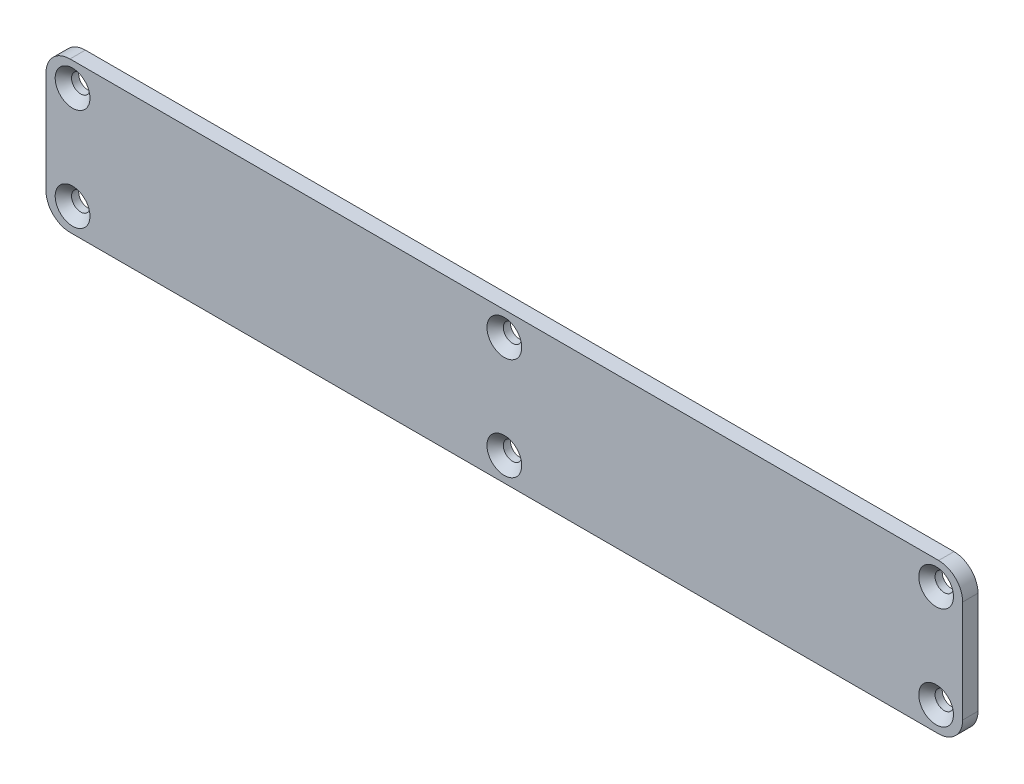
ISO-10303-21;
HEADER;
FILE_DESCRIPTION(('STEP AP214'),'2;1');
FILE_NAME('part.step','',(''),(''),'','','');
FILE_SCHEMA(('AUTOMOTIVE_DESIGN { 1 0 10303 214 1 1 1 1 }'));
ENDSEC;
DATA;
#1=APPLICATION_CONTEXT('core data for automotive mechanical design processes');
#2=APPLICATION_PROTOCOL_DEFINITION('international standard','automotive_design',2000,#1);
#3=PRODUCT_CONTEXT('',#1,'mechanical');
#4=PRODUCT('Part','Part','',(#3));
#5=PRODUCT_RELATED_PRODUCT_CATEGORY('part','',(#4));
#6=PRODUCT_DEFINITION_FORMATION('','',#4);
#7=PRODUCT_DEFINITION_CONTEXT('part definition',#1,'design');
#8=PRODUCT_DEFINITION('design','',#6,#7);
#9=PRODUCT_DEFINITION_SHAPE('','',#8);
#10=(LENGTH_UNIT() NAMED_UNIT(*) SI_UNIT(.MILLI.,.METRE.));
#11=(NAMED_UNIT(*) PLANE_ANGLE_UNIT() SI_UNIT($,.RADIAN.));
#12=(NAMED_UNIT(*) SI_UNIT($,.STERADIAN.) SOLID_ANGLE_UNIT());
#13=UNCERTAINTY_MEASURE_WITH_UNIT(LENGTH_MEASURE(1.E-05),#10,'distance_accuracy_value','');
#14=(GEOMETRIC_REPRESENTATION_CONTEXT(3) GLOBAL_UNCERTAINTY_ASSIGNED_CONTEXT((#13)) GLOBAL_UNIT_ASSIGNED_CONTEXT((#10,
#11,#12)) REPRESENTATION_CONTEXT('',''));
#15=CARTESIAN_POINT('',(0.,0.,0.));
#16=DIRECTION('',(0.,0.,1.));
#17=DIRECTION('',(1.,0.,0.));
#18=AXIS2_PLACEMENT_3D('',#15,#16,#17);
#19=CARTESIAN_POINT('',(0.,0.,3.));
#20=DIRECTION('',(0.,0.,-1.));
#21=DIRECTION('',(-1.,0.,0.));
#22=AXIS2_PLACEMENT_3D('',#19,#20,#21);
#23=PLANE('',#22);
#24=CARTESIAN_POINT('',(0.,-10.,3.));
#25=DIRECTION('',(0.,0.,1.));
#26=DIRECTION('',(1.,0.,0.));
#27=AXIS2_PLACEMENT_3D('',#24,#25,#26);
#28=CIRCLE('',#27,3.4);
#29=CARTESIAN_POINT('',(3.40000000000001,-10.,3.));
#30=VERTEX_POINT('',#29);
#31=EDGE_CURVE('E206',#30,#30,#28,.T.);
#32=ORIENTED_EDGE('',*,*,#31,.F.);
#33=EDGE_LOOP('',(#32));
#34=FACE_BOUND('',#33,.T.);
#35=CARTESIAN_POINT('',(0.,10.,3.));
#36=DIRECTION('',(0.,0.,1.));
#37=DIRECTION('',(1.,0.,0.));
#38=AXIS2_PLACEMENT_3D('',#35,#36,#37);
#39=CIRCLE('',#38,3.4);
#40=CARTESIAN_POINT('',(3.40000000000001,10.,3.));
#41=VERTEX_POINT('',#40);
#42=EDGE_CURVE('E199',#41,#41,#39,.T.);
#43=ORIENTED_EDGE('',*,*,#42,.F.);
#44=EDGE_LOOP('',(#43));
#45=FACE_BOUND('',#44,.T.);
#46=CARTESIAN_POINT('',(-84.5,-10.,3.));
#47=DIRECTION('',(0.,0.,1.));
#48=DIRECTION('',(1.,0.,0.));
#49=AXIS2_PLACEMENT_3D('',#46,#47,#48);
#50=CIRCLE('',#49,3.4);
#51=CARTESIAN_POINT('',(-81.1,-10.,3.));
#52=VERTEX_POINT('',#51);
#53=EDGE_CURVE('E192',#52,#52,#50,.T.);
#54=ORIENTED_EDGE('',*,*,#53,.F.);
#55=EDGE_LOOP('',(#54));
#56=FACE_BOUND('',#55,.T.);
#57=CARTESIAN_POINT('',(84.5,10.,3.));
#58=DIRECTION('',(0.,0.,1.));
#59=DIRECTION('',(1.,0.,0.));
#60=AXIS2_PLACEMENT_3D('',#57,#58,#59);
#61=CIRCLE('',#60,3.4);
#62=CARTESIAN_POINT('',(87.9,10.,3.));
#63=VERTEX_POINT('',#62);
#64=EDGE_CURVE('E185',#63,#63,#61,.T.);
#65=ORIENTED_EDGE('',*,*,#64,.F.);
#66=EDGE_LOOP('',(#65));
#67=FACE_BOUND('',#66,.T.);
#68=CARTESIAN_POINT('',(84.5,-10.,3.));
#69=DIRECTION('',(0.,0.,1.));
#70=DIRECTION('',(1.,0.,0.));
#71=AXIS2_PLACEMENT_3D('',#68,#69,#70);
#72=CIRCLE('',#71,3.4);
#73=CARTESIAN_POINT('',(87.9,-10.,3.));
#74=VERTEX_POINT('',#73);
#75=EDGE_CURVE('E178',#74,#74,#72,.T.);
#76=ORIENTED_EDGE('',*,*,#75,.F.);
#77=EDGE_LOOP('',(#76));
#78=FACE_BOUND('',#77,.T.);
#79=CARTESIAN_POINT('',(-84.5,10.,3.));
#80=DIRECTION('',(0.,0.,1.));
#81=DIRECTION('',(1.,0.,0.));
#82=AXIS2_PLACEMENT_3D('',#79,#80,#81);
#83=CIRCLE('',#82,3.4);
#84=CARTESIAN_POINT('',(-81.1,10.,3.));
#85=VERTEX_POINT('',#84);
#86=EDGE_CURVE('E163',#85,#85,#83,.T.);
#87=ORIENTED_EDGE('',*,*,#86,.F.);
#88=EDGE_LOOP('',(#87));
#89=FACE_BOUND('',#88,.T.);
#90=CARTESIAN_POINT('',(-85.,-9.99999999999999,3.));
#91=DIRECTION('',(0.,0.,1.));
#92=DIRECTION('',(1.,0.,0.));
#93=AXIS2_PLACEMENT_3D('',#90,#91,#92);
#94=CIRCLE('',#93,4.7);
#95=CARTESIAN_POINT('',(-89.7,-10.,3.));
#96=VERTEX_POINT('',#95);
#97=CARTESIAN_POINT('',(-85.,-14.7,3.));
#98=VERTEX_POINT('',#97);
#99=EDGE_CURVE('E141',#96,#98,#94,.T.);
#100=ORIENTED_EDGE('',*,*,#99,.T.);
#101=DIRECTION('',(1.,0.,0.));
#102=VECTOR('',#101,1.);
#103=CARTESIAN_POINT('',(-85.,-14.7,3.));
#104=LINE('',#103,#102);
#105=CARTESIAN_POINT('',(84.9999999999999,-14.7,3.));
#106=VERTEX_POINT('',#105);
#107=EDGE_CURVE('E144',#98,#106,#104,.T.);
#108=ORIENTED_EDGE('',*,*,#107,.T.);
#109=CARTESIAN_POINT('',(85.,-9.99999999999999,3.));
#110=DIRECTION('',(0.,0.,1.));
#111=DIRECTION('',(1.,0.,0.));
#112=AXIS2_PLACEMENT_3D('',#109,#110,#111);
#113=CIRCLE('',#112,4.69999999999999);
#114=CARTESIAN_POINT('',(89.7,-9.99999999999999,3.));
#115=VERTEX_POINT('',#114);
#116=EDGE_CURVE('E55',#106,#115,#113,.T.);
#117=ORIENTED_EDGE('',*,*,#116,.T.);
#118=DIRECTION('',(0.,1.,0.));
#119=VECTOR('',#118,1.);
#120=CARTESIAN_POINT('',(89.7,-10.,3.));
#121=LINE('',#120,#119);
#122=CARTESIAN_POINT('',(89.7,10.,3.));
#123=VERTEX_POINT('',#122);
#124=EDGE_CURVE('E112',#115,#123,#121,.T.);
#125=ORIENTED_EDGE('',*,*,#124,.T.);
#126=CARTESIAN_POINT('',(85.,10.,3.));
#127=DIRECTION('',(0.,0.,1.));
#128=DIRECTION('',(1.,0.,0.));
#129=AXIS2_PLACEMENT_3D('',#126,#127,#128);
#130=CIRCLE('',#129,4.70000000000001);
#131=CARTESIAN_POINT('',(84.9999999999999,14.7,3.));
#132=VERTEX_POINT('',#131);
#133=EDGE_CURVE('E149',#123,#132,#130,.T.);
#134=ORIENTED_EDGE('',*,*,#133,.T.);
#135=DIRECTION('',(-1.,0.,0.));
#136=VECTOR('',#135,1.);
#137=CARTESIAN_POINT('',(84.9999999999999,14.7,3.));
#138=LINE('',#137,#136);
#139=CARTESIAN_POINT('',(-85.,14.7,3.));
#140=VERTEX_POINT('',#139);
#141=EDGE_CURVE('E152',#132,#140,#138,.T.);
#142=ORIENTED_EDGE('',*,*,#141,.T.);
#143=CARTESIAN_POINT('',(-85.,10.,3.));
#144=DIRECTION('',(0.,0.,1.));
#145=DIRECTION('',(1.,0.,0.));
#146=AXIS2_PLACEMENT_3D('',#143,#144,#145);
#147=CIRCLE('',#146,4.69999999999998);
#148=CARTESIAN_POINT('',(-89.7,10.,3.));
#149=VERTEX_POINT('',#148);
#150=EDGE_CURVE('E155',#140,#149,#147,.T.);
#151=ORIENTED_EDGE('',*,*,#150,.T.);
#152=DIRECTION('',(0.,-1.,0.));
#153=VECTOR('',#152,1.);
#154=CARTESIAN_POINT('',(-89.7,10.,3.));
#155=LINE('',#154,#153);
#156=EDGE_CURVE('E158',#149,#96,#155,.T.);
#157=ORIENTED_EDGE('',*,*,#156,.T.);
#158=EDGE_LOOP('',(#100,#108,#117,#125,#134,#142,#151,#157));
#159=FACE_BOUND('',#158,.T.);
#160=ADVANCED_FACE('F38',(#34,#45,#56,#67,#78,#89,#159),#23,.F.);
#161=CARTESIAN_POINT('',(0.,0.,0.));
#162=DIRECTION('',(0.,0.,-1.));
#163=DIRECTION('',(-1.,0.,0.));
#164=AXIS2_PLACEMENT_3D('',#161,#162,#163);
#165=PLANE('',#164);
#166=CARTESIAN_POINT('',(0.,-10.,0.));
#167=DIRECTION('',(0.,0.,-1.));
#168=DIRECTION('',(-1.,0.,0.));
#169=AXIS2_PLACEMENT_3D('',#166,#167,#168);
#170=CIRCLE('',#169,1.8);
#171=CARTESIAN_POINT('',(-1.79999999999998,-10.,0.));
#172=VERTEX_POINT('',#171);
#173=EDGE_CURVE('E11',#172,#172,#170,.T.);
#174=ORIENTED_EDGE('',*,*,#173,.F.);
#175=EDGE_LOOP('',(#174));
#176=FACE_BOUND('',#175,.T.);
#177=CARTESIAN_POINT('',(0.,10.,0.));
#178=DIRECTION('',(0.,0.,-1.));
#179=DIRECTION('',(-1.,0.,0.));
#180=AXIS2_PLACEMENT_3D('',#177,#178,#179);
#181=CIRCLE('',#180,1.8);
#182=CARTESIAN_POINT('',(-1.79999999999998,10.,0.));
#183=VERTEX_POINT('',#182);
#184=EDGE_CURVE('E205',#183,#183,#181,.T.);
#185=ORIENTED_EDGE('',*,*,#184,.F.);
#186=EDGE_LOOP('',(#185));
#187=FACE_BOUND('',#186,.T.);
#188=CARTESIAN_POINT('',(-84.5,-10.,0.));
#189=DIRECTION('',(0.,0.,-1.));
#190=DIRECTION('',(-1.,0.,0.));
#191=AXIS2_PLACEMENT_3D('',#188,#189,#190);
#192=CIRCLE('',#191,1.8);
#193=CARTESIAN_POINT('',(-86.3,-10.,0.));
#194=VERTEX_POINT('',#193);
#195=EDGE_CURVE('E198',#194,#194,#192,.T.);
#196=ORIENTED_EDGE('',*,*,#195,.F.);
#197=EDGE_LOOP('',(#196));
#198=FACE_BOUND('',#197,.T.);
#199=CARTESIAN_POINT('',(84.5,10.,0.));
#200=DIRECTION('',(0.,0.,-1.));
#201=DIRECTION('',(-1.,0.,0.));
#202=AXIS2_PLACEMENT_3D('',#199,#200,#201);
#203=CIRCLE('',#202,1.8);
#204=CARTESIAN_POINT('',(82.7,10.,0.));
#205=VERTEX_POINT('',#204);
#206=EDGE_CURVE('E191',#205,#205,#203,.T.);
#207=ORIENTED_EDGE('',*,*,#206,.F.);
#208=EDGE_LOOP('',(#207));
#209=FACE_BOUND('',#208,.T.);
#210=CARTESIAN_POINT('',(84.5,-10.,0.));
#211=DIRECTION('',(0.,0.,-1.));
#212=DIRECTION('',(-1.,0.,0.));
#213=AXIS2_PLACEMENT_3D('',#210,#211,#212);
#214=CIRCLE('',#213,1.8);
#215=CARTESIAN_POINT('',(82.7,-10.,0.));
#216=VERTEX_POINT('',#215);
#217=EDGE_CURVE('E184',#216,#216,#214,.T.);
#218=ORIENTED_EDGE('',*,*,#217,.F.);
#219=EDGE_LOOP('',(#218));
#220=FACE_BOUND('',#219,.T.);
#221=CARTESIAN_POINT('',(-84.5,10.,0.));
#222=DIRECTION('',(0.,0.,-1.));
#223=DIRECTION('',(-1.,0.,0.));
#224=AXIS2_PLACEMENT_3D('',#221,#222,#223);
#225=CIRCLE('',#224,1.8);
#226=CARTESIAN_POINT('',(-86.3,10.,0.));
#227=VERTEX_POINT('',#226);
#228=EDGE_CURVE('E42',#227,#227,#225,.T.);
#229=ORIENTED_EDGE('',*,*,#228,.F.);
#230=EDGE_LOOP('',(#229));
#231=FACE_BOUND('',#230,.T.);
#232=DIRECTION('',(1.,0.,0.));
#233=VECTOR('',#232,1.);
#234=CARTESIAN_POINT('',(-85.,-14.7,0.));
#235=LINE('',#234,#233);
#236=CARTESIAN_POINT('',(-85.,-14.7,0.));
#237=VERTEX_POINT('',#236);
#238=CARTESIAN_POINT('',(84.9999999999999,-14.7,0.));
#239=VERTEX_POINT('',#238);
#240=EDGE_CURVE('E122',#237,#239,#235,.T.);
#241=ORIENTED_EDGE('',*,*,#240,.F.);
#242=CARTESIAN_POINT('',(-85.,-9.99999999999999,0.));
#243=DIRECTION('',(0.,0.,1.));
#244=DIRECTION('',(1.,0.,0.));
#245=AXIS2_PLACEMENT_3D('',#242,#243,#244);
#246=CIRCLE('',#245,4.7);
#247=CARTESIAN_POINT('',(-89.7,-10.,0.));
#248=VERTEX_POINT('',#247);
#249=EDGE_CURVE('E63',#248,#237,#246,.T.);
#250=ORIENTED_EDGE('',*,*,#249,.F.);
#251=DIRECTION('',(0.,-1.,0.));
#252=VECTOR('',#251,1.);
#253=CARTESIAN_POINT('',(-89.7,10.,0.));
#254=LINE('',#253,#252);
#255=CARTESIAN_POINT('',(-89.7,10.,0.));
#256=VERTEX_POINT('',#255);
#257=EDGE_CURVE('E137',#256,#248,#254,.T.);
#258=ORIENTED_EDGE('',*,*,#257,.F.);
#259=CARTESIAN_POINT('',(-85.,10.,0.));
#260=DIRECTION('',(0.,0.,1.));
#261=DIRECTION('',(1.,0.,0.));
#262=AXIS2_PLACEMENT_3D('',#259,#260,#261);
#263=CIRCLE('',#262,4.69999999999998);
#264=CARTESIAN_POINT('',(-85.,14.7,0.));
#265=VERTEX_POINT('',#264);
#266=EDGE_CURVE('E134',#265,#256,#263,.T.);
#267=ORIENTED_EDGE('',*,*,#266,.F.);
#268=DIRECTION('',(-1.,0.,0.));
#269=VECTOR('',#268,1.);
#270=CARTESIAN_POINT('',(84.9999999999999,14.7,0.));
#271=LINE('',#270,#269);
#272=CARTESIAN_POINT('',(84.9999999999999,14.7,0.));
#273=VERTEX_POINT('',#272);
#274=EDGE_CURVE('E128',#273,#265,#271,.T.);
#275=ORIENTED_EDGE('',*,*,#274,.F.);
#276=CARTESIAN_POINT('',(85.,10.,0.));
#277=DIRECTION('',(0.,0.,1.));
#278=DIRECTION('',(1.,0.,0.));
#279=AXIS2_PLACEMENT_3D('',#276,#277,#278);
#280=CIRCLE('',#279,4.70000000000001);
#281=CARTESIAN_POINT('',(89.7,10.,0.));
#282=VERTEX_POINT('',#281);
#283=EDGE_CURVE('E126',#282,#273,#280,.T.);
#284=ORIENTED_EDGE('',*,*,#283,.F.);
#285=DIRECTION('',(0.,1.,0.));
#286=VECTOR('',#285,1.);
#287=CARTESIAN_POINT('',(89.7,-10.,0.));
#288=LINE('',#287,#286);
#289=CARTESIAN_POINT('',(89.7,-9.99999999999999,0.));
#290=VERTEX_POINT('',#289);
#291=EDGE_CURVE('E109',#290,#282,#288,.T.);
#292=ORIENTED_EDGE('',*,*,#291,.F.);
#293=CARTESIAN_POINT('',(85.,-9.99999999999999,0.));
#294=DIRECTION('',(0.,0.,1.));
#295=DIRECTION('',(1.,0.,0.));
#296=AXIS2_PLACEMENT_3D('',#293,#294,#295);
#297=CIRCLE('',#296,4.69999999999999);
#298=EDGE_CURVE('E117',#239,#290,#297,.T.);
#299=ORIENTED_EDGE('',*,*,#298,.F.);
#300=EDGE_LOOP('',(#241,#250,#258,#267,#275,#284,#292,#299));
#301=FACE_BOUND('',#300,.T.);
#302=ADVANCED_FACE('F40',(#176,#187,#198,#209,#220,#231,#301),#165,.T.);
#303=CARTESIAN_POINT('',(0.,-10.,3.));
#304=DIRECTION('',(0.,0.,1.));
#305=DIRECTION('',(1.,0.,0.));
#306=AXIS2_PLACEMENT_3D('',#303,#304,#305);
#307=CYLINDRICAL_SURFACE('',#306,1.8);
#308=ORIENTED_EDGE('',*,*,#173,.T.);
#309=EDGE_LOOP('',(#308));
#310=FACE_BOUND('',#309,.T.);
#311=CARTESIAN_POINT('',(0.,-10.,1.4));
#312=DIRECTION('',(0.,0.,1.));
#313=DIRECTION('',(1.,0.,0.));
#314=AXIS2_PLACEMENT_3D('',#311,#312,#313);
#315=CIRCLE('',#314,1.8);
#316=CARTESIAN_POINT('',(1.80000000000001,-10.,1.4));
#317=VERTEX_POINT('',#316);
#318=EDGE_CURVE('E47',#317,#317,#315,.T.);
#319=ORIENTED_EDGE('',*,*,#318,.T.);
#320=EDGE_LOOP('',(#319));
#321=FACE_BOUND('',#320,.T.);
#322=ADVANCED_FACE('F224',(#310,#321),#307,.F.);
#323=CARTESIAN_POINT('',(0.,-10.,3.));
#324=DIRECTION('',(0.,0.,1.));
#325=DIRECTION('',(1.,0.,0.));
#326=AXIS2_PLACEMENT_3D('',#323,#324,#325);
#327=CONICAL_SURFACE('',#326,3.4,0.785398163397448);
#328=ORIENTED_EDGE('',*,*,#318,.F.);
#329=EDGE_LOOP('',(#328));
#330=FACE_BOUND('',#329,.T.);
#331=ORIENTED_EDGE('',*,*,#31,.T.);
#332=EDGE_LOOP('',(#331));
#333=FACE_BOUND('',#332,.T.);
#334=ADVANCED_FACE('F309',(#330,#333),#327,.F.);
#335=CARTESIAN_POINT('',(0.,10.,3.));
#336=DIRECTION('',(0.,0.,1.));
#337=DIRECTION('',(1.,0.,0.));
#338=AXIS2_PLACEMENT_3D('',#335,#336,#337);
#339=CYLINDRICAL_SURFACE('',#338,1.8);
#340=ORIENTED_EDGE('',*,*,#184,.T.);
#341=EDGE_LOOP('',(#340));
#342=FACE_BOUND('',#341,.T.);
#343=CARTESIAN_POINT('',(0.,10.,1.4));
#344=DIRECTION('',(0.,0.,1.));
#345=DIRECTION('',(1.,0.,0.));
#346=AXIS2_PLACEMENT_3D('',#343,#344,#345);
#347=CIRCLE('',#346,1.8);
#348=CARTESIAN_POINT('',(1.80000000000001,10.,1.4));
#349=VERTEX_POINT('',#348);
#350=EDGE_CURVE('E202',#349,#349,#347,.T.);
#351=ORIENTED_EDGE('',*,*,#350,.T.);
#352=EDGE_LOOP('',(#351));
#353=FACE_BOUND('',#352,.T.);
#354=ADVANCED_FACE('F305',(#342,#353),#339,.F.);
#355=CARTESIAN_POINT('',(0.,10.,3.));
#356=DIRECTION('',(0.,0.,1.));
#357=DIRECTION('',(1.,0.,0.));
#358=AXIS2_PLACEMENT_3D('',#355,#356,#357);
#359=CONICAL_SURFACE('',#358,3.4,0.785398163397448);
#360=ORIENTED_EDGE('',*,*,#350,.F.);
#361=EDGE_LOOP('',(#360));
#362=FACE_BOUND('',#361,.T.);
#363=ORIENTED_EDGE('',*,*,#42,.T.);
#364=EDGE_LOOP('',(#363));
#365=FACE_BOUND('',#364,.T.);
#366=ADVANCED_FACE('F301',(#362,#365),#359,.F.);
#367=CARTESIAN_POINT('',(-84.5,-10.,3.));
#368=DIRECTION('',(0.,0.,1.));
#369=DIRECTION('',(1.,0.,0.));
#370=AXIS2_PLACEMENT_3D('',#367,#368,#369);
#371=CYLINDRICAL_SURFACE('',#370,1.8);
#372=ORIENTED_EDGE('',*,*,#195,.T.);
#373=EDGE_LOOP('',(#372));
#374=FACE_BOUND('',#373,.T.);
#375=CARTESIAN_POINT('',(-84.5,-10.,1.4));
#376=DIRECTION('',(0.,0.,1.));
#377=DIRECTION('',(1.,0.,0.));
#378=AXIS2_PLACEMENT_3D('',#375,#376,#377);
#379=CIRCLE('',#378,1.8);
#380=CARTESIAN_POINT('',(-82.7,-10.,1.4));
#381=VERTEX_POINT('',#380);
#382=EDGE_CURVE('E195',#381,#381,#379,.T.);
#383=ORIENTED_EDGE('',*,*,#382,.T.);
#384=EDGE_LOOP('',(#383));
#385=FACE_BOUND('',#384,.T.);
#386=ADVANCED_FACE('F297',(#374,#385),#371,.F.);
#387=CARTESIAN_POINT('',(-84.5,-10.,3.));
#388=DIRECTION('',(0.,0.,1.));
#389=DIRECTION('',(1.,0.,0.));
#390=AXIS2_PLACEMENT_3D('',#387,#388,#389);
#391=CONICAL_SURFACE('',#390,3.4,0.785398163397449);
#392=ORIENTED_EDGE('',*,*,#382,.F.);
#393=EDGE_LOOP('',(#392));
#394=FACE_BOUND('',#393,.T.);
#395=ORIENTED_EDGE('',*,*,#53,.T.);
#396=EDGE_LOOP('',(#395));
#397=FACE_BOUND('',#396,.T.);
#398=ADVANCED_FACE('F293',(#394,#397),#391,.F.);
#399=CARTESIAN_POINT('',(84.5,10.,3.));
#400=DIRECTION('',(0.,0.,1.));
#401=DIRECTION('',(1.,0.,0.));
#402=AXIS2_PLACEMENT_3D('',#399,#400,#401);
#403=CYLINDRICAL_SURFACE('',#402,1.8);
#404=ORIENTED_EDGE('',*,*,#206,.T.);
#405=EDGE_LOOP('',(#404));
#406=FACE_BOUND('',#405,.T.);
#407=CARTESIAN_POINT('',(84.5,10.,1.4));
#408=DIRECTION('',(0.,0.,1.));
#409=DIRECTION('',(1.,0.,0.));
#410=AXIS2_PLACEMENT_3D('',#407,#408,#409);
#411=CIRCLE('',#410,1.8);
#412=CARTESIAN_POINT('',(86.3,10.,1.4));
#413=VERTEX_POINT('',#412);
#414=EDGE_CURVE('E188',#413,#413,#411,.T.);
#415=ORIENTED_EDGE('',*,*,#414,.T.);
#416=EDGE_LOOP('',(#415));
#417=FACE_BOUND('',#416,.T.);
#418=ADVANCED_FACE('F289',(#406,#417),#403,.F.);
#419=CARTESIAN_POINT('',(84.5,10.,3.));
#420=DIRECTION('',(0.,0.,1.));
#421=DIRECTION('',(1.,0.,0.));
#422=AXIS2_PLACEMENT_3D('',#419,#420,#421);
#423=CONICAL_SURFACE('',#422,3.4,0.785398163397449);
#424=ORIENTED_EDGE('',*,*,#414,.F.);
#425=EDGE_LOOP('',(#424));
#426=FACE_BOUND('',#425,.T.);
#427=ORIENTED_EDGE('',*,*,#64,.T.);
#428=EDGE_LOOP('',(#427));
#429=FACE_BOUND('',#428,.T.);
#430=ADVANCED_FACE('F286',(#426,#429),#423,.F.);
#431=CARTESIAN_POINT('',(84.5,-10.,3.));
#432=DIRECTION('',(0.,0.,1.));
#433=DIRECTION('',(1.,0.,0.));
#434=AXIS2_PLACEMENT_3D('',#431,#432,#433);
#435=CYLINDRICAL_SURFACE('',#434,1.8);
#436=ORIENTED_EDGE('',*,*,#217,.T.);
#437=EDGE_LOOP('',(#436));
#438=FACE_BOUND('',#437,.T.);
#439=CARTESIAN_POINT('',(84.5,-10.,1.4));
#440=DIRECTION('',(0.,0.,1.));
#441=DIRECTION('',(1.,0.,0.));
#442=AXIS2_PLACEMENT_3D('',#439,#440,#441);
#443=CIRCLE('',#442,1.8);
#444=CARTESIAN_POINT('',(86.3,-10.,1.4));
#445=VERTEX_POINT('',#444);
#446=EDGE_CURVE('E181',#445,#445,#443,.T.);
#447=ORIENTED_EDGE('',*,*,#446,.T.);
#448=EDGE_LOOP('',(#447));
#449=FACE_BOUND('',#448,.T.);
#450=ADVANCED_FACE('F219',(#438,#449),#435,.F.);
#451=CARTESIAN_POINT('',(84.5,-10.,3.));
#452=DIRECTION('',(0.,0.,1.));
#453=DIRECTION('',(1.,0.,0.));
#454=AXIS2_PLACEMENT_3D('',#451,#452,#453);
#455=CONICAL_SURFACE('',#454,3.4,0.785398163397449);
#456=ORIENTED_EDGE('',*,*,#446,.F.);
#457=EDGE_LOOP('',(#456));
#458=FACE_BOUND('',#457,.T.);
#459=ORIENTED_EDGE('',*,*,#75,.T.);
#460=EDGE_LOOP('',(#459));
#461=FACE_BOUND('',#460,.T.);
#462=ADVANCED_FACE('F233',(#458,#461),#455,.F.);
#463=CARTESIAN_POINT('',(-84.5,10.,3.));
#464=DIRECTION('',(0.,0.,1.));
#465=DIRECTION('',(1.,0.,0.));
#466=AXIS2_PLACEMENT_3D('',#463,#464,#465);
#467=CYLINDRICAL_SURFACE('',#466,1.8);
#468=ORIENTED_EDGE('',*,*,#228,.T.);
#469=EDGE_LOOP('',(#468));
#470=FACE_BOUND('',#469,.T.);
#471=CARTESIAN_POINT('',(-84.5,10.,1.4));
#472=DIRECTION('',(0.,0.,1.));
#473=DIRECTION('',(1.,0.,0.));
#474=AXIS2_PLACEMENT_3D('',#471,#472,#473);
#475=CIRCLE('',#474,1.8);
#476=CARTESIAN_POINT('',(-82.7,10.,1.4));
#477=VERTEX_POINT('',#476);
#478=EDGE_CURVE('E175',#477,#477,#475,.T.);
#479=ORIENTED_EDGE('',*,*,#478,.T.);
#480=EDGE_LOOP('',(#479));
#481=FACE_BOUND('',#480,.T.);
#482=ADVANCED_FACE('F229',(#470,#481),#467,.F.);
#483=CARTESIAN_POINT('',(-84.5,10.,3.));
#484=DIRECTION('',(0.,0.,1.));
#485=DIRECTION('',(1.,0.,0.));
#486=AXIS2_PLACEMENT_3D('',#483,#484,#485);
#487=CONICAL_SURFACE('',#486,3.4,0.785398163397449);
#488=ORIENTED_EDGE('',*,*,#478,.F.);
#489=EDGE_LOOP('',(#488));
#490=FACE_BOUND('',#489,.T.);
#491=ORIENTED_EDGE('',*,*,#86,.T.);
#492=EDGE_LOOP('',(#491));
#493=FACE_BOUND('',#492,.T.);
#494=ADVANCED_FACE('F232',(#490,#493),#487,.F.);
#495=CARTESIAN_POINT('',(-85.,-9.99999999999999,0.));
#496=DIRECTION('',(0.,0.,1.));
#497=DIRECTION('',(1.,0.,0.));
#498=AXIS2_PLACEMENT_3D('',#495,#496,#497);
#499=CYLINDRICAL_SURFACE('',#498,4.7);
#500=ORIENTED_EDGE('',*,*,#99,.F.);
#501=DIRECTION('',(0.,0.,1.));
#502=VECTOR('',#501,1.);
#503=CARTESIAN_POINT('',(-89.7,-10.,0.));
#504=LINE('',#503,#502);
#505=EDGE_CURVE('E161',#248,#96,#504,.T.);
#506=ORIENTED_EDGE('',*,*,#505,.F.);
#507=ORIENTED_EDGE('',*,*,#249,.T.);
#508=DIRECTION('',(0.,0.,1.));
#509=VECTOR('',#508,1.);
#510=CARTESIAN_POINT('',(-85.,-14.7,0.));
#511=LINE('',#510,#509);
#512=EDGE_CURVE('E140',#237,#98,#511,.T.);
#513=ORIENTED_EDGE('',*,*,#512,.T.);
#514=EDGE_LOOP('',(#500,#506,#507,#513));
#515=FACE_BOUND('',#514,.T.);
#516=ADVANCED_FACE('F239',(#515),#499,.T.);
#517=CARTESIAN_POINT('',(-89.7,10.,0.));
#518=DIRECTION('',(-1.,0.,0.));
#519=DIRECTION('',(0.,-1.,0.));
#520=AXIS2_PLACEMENT_3D('',#517,#518,#519);
#521=PLANE('',#520);
#522=ORIENTED_EDGE('',*,*,#156,.F.);
#523=DIRECTION('',(0.,0.,1.));
#524=VECTOR('',#523,1.);
#525=CARTESIAN_POINT('',(-89.7,10.,0.));
#526=LINE('',#525,#524);
#527=EDGE_CURVE('E164',#256,#149,#526,.T.);
#528=ORIENTED_EDGE('',*,*,#527,.F.);
#529=ORIENTED_EDGE('',*,*,#257,.T.);
#530=ORIENTED_EDGE('',*,*,#505,.T.);
#531=EDGE_LOOP('',(#522,#528,#529,#530));
#532=FACE_BOUND('',#531,.T.);
#533=ADVANCED_FACE('F255',(#532),#521,.T.);
#534=CARTESIAN_POINT('',(-85.,10.,0.));
#535=DIRECTION('',(0.,0.,1.));
#536=DIRECTION('',(1.,0.,0.));
#537=AXIS2_PLACEMENT_3D('',#534,#535,#536);
#538=CYLINDRICAL_SURFACE('',#537,4.69999999999998);
#539=ORIENTED_EDGE('',*,*,#150,.F.);
#540=DIRECTION('',(0.,0.,1.));
#541=VECTOR('',#540,1.);
#542=CARTESIAN_POINT('',(-85.,14.7,0.));
#543=LINE('',#542,#541);
#544=EDGE_CURVE('E166',#265,#140,#543,.T.);
#545=ORIENTED_EDGE('',*,*,#544,.F.);
#546=ORIENTED_EDGE('',*,*,#266,.T.);
#547=ORIENTED_EDGE('',*,*,#527,.T.);
#548=EDGE_LOOP('',(#539,#545,#546,#547));
#549=FACE_BOUND('',#548,.T.);
#550=ADVANCED_FACE('F258',(#549),#538,.T.);
#551=CARTESIAN_POINT('',(84.9999999999999,14.7,0.));
#552=DIRECTION('',(0.,1.,0.));
#553=DIRECTION('',(-1.,0.,0.));
#554=AXIS2_PLACEMENT_3D('',#551,#552,#553);
#555=PLANE('',#554);
#556=ORIENTED_EDGE('',*,*,#141,.F.);
#557=DIRECTION('',(0.,0.,1.));
#558=VECTOR('',#557,1.);
#559=CARTESIAN_POINT('',(84.9999999999999,14.7,0.));
#560=LINE('',#559,#558);
#561=EDGE_CURVE('E168',#273,#132,#560,.T.);
#562=ORIENTED_EDGE('',*,*,#561,.F.);
#563=ORIENTED_EDGE('',*,*,#274,.T.);
#564=ORIENTED_EDGE('',*,*,#544,.T.);
#565=EDGE_LOOP('',(#556,#562,#563,#564));
#566=FACE_BOUND('',#565,.T.);
#567=ADVANCED_FACE('F261',(#566),#555,.T.);
#568=CARTESIAN_POINT('',(85.,10.,0.));
#569=DIRECTION('',(0.,0.,1.));
#570=DIRECTION('',(1.,0.,0.));
#571=AXIS2_PLACEMENT_3D('',#568,#569,#570);
#572=CYLINDRICAL_SURFACE('',#571,4.70000000000001);
#573=ORIENTED_EDGE('',*,*,#133,.F.);
#574=DIRECTION('',(0.,0.,1.));
#575=VECTOR('',#574,1.);
#576=CARTESIAN_POINT('',(89.7,10.,0.));
#577=LINE('',#576,#575);
#578=EDGE_CURVE('E113',#282,#123,#577,.T.);
#579=ORIENTED_EDGE('',*,*,#578,.F.);
#580=ORIENTED_EDGE('',*,*,#283,.T.);
#581=ORIENTED_EDGE('',*,*,#561,.T.);
#582=EDGE_LOOP('',(#573,#579,#580,#581));
#583=FACE_BOUND('',#582,.T.);
#584=ADVANCED_FACE('F264',(#583),#572,.T.);
#585=CARTESIAN_POINT('',(89.7,-10.,0.));
#586=DIRECTION('',(1.,0.,0.));
#587=DIRECTION('',(0.,1.,0.));
#588=AXIS2_PLACEMENT_3D('',#585,#586,#587);
#589=PLANE('',#588);
#590=ORIENTED_EDGE('',*,*,#124,.F.);
#591=DIRECTION('',(0.,0.,1.));
#592=VECTOR('',#591,1.);
#593=CARTESIAN_POINT('',(89.7,-9.99999999999999,0.));
#594=LINE('',#593,#592);
#595=EDGE_CURVE('E105',#290,#115,#594,.T.);
#596=ORIENTED_EDGE('',*,*,#595,.F.);
#597=ORIENTED_EDGE('',*,*,#291,.T.);
#598=ORIENTED_EDGE('',*,*,#578,.T.);
#599=EDGE_LOOP('',(#590,#596,#597,#598));
#600=FACE_BOUND('',#599,.T.);
#601=ADVANCED_FACE('F107',(#600),#589,.T.);
#602=CARTESIAN_POINT('',(85.,-9.99999999999999,0.));
#603=DIRECTION('',(0.,0.,1.));
#604=DIRECTION('',(1.,0.,0.));
#605=AXIS2_PLACEMENT_3D('',#602,#603,#604);
#606=CYLINDRICAL_SURFACE('',#605,4.69999999999999);
#607=ORIENTED_EDGE('',*,*,#116,.F.);
#608=DIRECTION('',(0.,0.,1.));
#609=VECTOR('',#608,1.);
#610=CARTESIAN_POINT('',(84.9999999999999,-14.7,0.));
#611=LINE('',#610,#609);
#612=EDGE_CURVE('E114',#239,#106,#611,.T.);
#613=ORIENTED_EDGE('',*,*,#612,.F.);
#614=ORIENTED_EDGE('',*,*,#298,.T.);
#615=ORIENTED_EDGE('',*,*,#595,.T.);
#616=EDGE_LOOP('',(#607,#613,#614,#615));
#617=FACE_BOUND('',#616,.T.);
#618=ADVANCED_FACE('F118',(#617),#606,.T.);
#619=CARTESIAN_POINT('',(-85.,-14.7,0.));
#620=DIRECTION('',(0.,-1.,0.));
#621=DIRECTION('',(1.,0.,0.));
#622=AXIS2_PLACEMENT_3D('',#619,#620,#621);
#623=PLANE('',#622);
#624=ORIENTED_EDGE('',*,*,#107,.F.);
#625=ORIENTED_EDGE('',*,*,#512,.F.);
#626=ORIENTED_EDGE('',*,*,#240,.T.);
#627=ORIENTED_EDGE('',*,*,#612,.T.);
#628=EDGE_LOOP('',(#624,#625,#626,#627));
#629=FACE_BOUND('',#628,.T.);
#630=ADVANCED_FACE('F250',(#629),#623,.T.);
#631=CLOSED_SHELL('',(#160,#302,#322,#334,#354,#366,#386,#398,#418,#430,#450,#462,#482,#494,
#516,#533,#550,#567,#584,#601,#618,#630));
#632=MANIFOLD_SOLID_BREP('B2',#631);
#633=ADVANCED_BREP_SHAPE_REPRESENTATION('',(#18,#632),#14);
#634=SHAPE_DEFINITION_REPRESENTATION(#9,#633);
ENDSEC;
END-ISO-10303-21;
